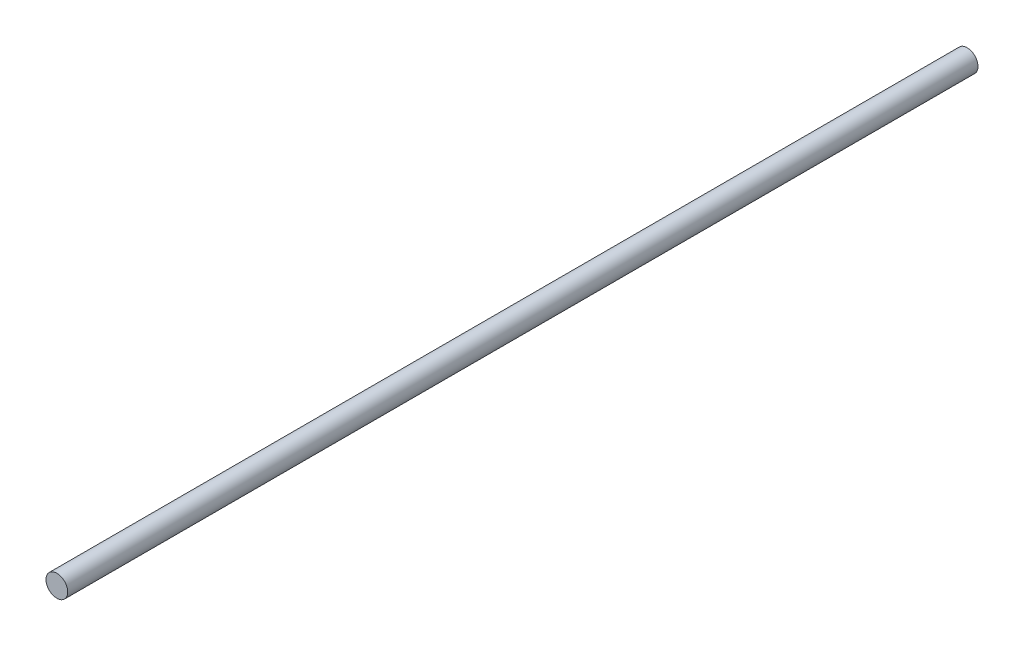
ISO-10303-21;
HEADER;
FILE_DESCRIPTION(('STEP AP214'),'2;1');
FILE_NAME('part.step','',(''),(''),'','','');
FILE_SCHEMA(('AUTOMOTIVE_DESIGN { 1 0 10303 214 1 1 1 1 }'));
ENDSEC;
DATA;
#1=APPLICATION_CONTEXT('core data for automotive mechanical design processes');
#2=APPLICATION_PROTOCOL_DEFINITION('international standard','automotive_design',2000,#1);
#3=PRODUCT_CONTEXT('',#1,'mechanical');
#4=PRODUCT('Part','Part','',(#3));
#5=PRODUCT_RELATED_PRODUCT_CATEGORY('part','',(#4));
#6=PRODUCT_DEFINITION_FORMATION('','',#4);
#7=PRODUCT_DEFINITION_CONTEXT('part definition',#1,'design');
#8=PRODUCT_DEFINITION('design','',#6,#7);
#9=PRODUCT_DEFINITION_SHAPE('','',#8);
#10=(LENGTH_UNIT() NAMED_UNIT(*) SI_UNIT(.MILLI.,.METRE.));
#11=(NAMED_UNIT(*) PLANE_ANGLE_UNIT() SI_UNIT($,.RADIAN.));
#12=(NAMED_UNIT(*) SI_UNIT($,.STERADIAN.) SOLID_ANGLE_UNIT());
#13=UNCERTAINTY_MEASURE_WITH_UNIT(LENGTH_MEASURE(1.E-05),#10,'distance_accuracy_value','');
#14=(GEOMETRIC_REPRESENTATION_CONTEXT(3) GLOBAL_UNCERTAINTY_ASSIGNED_CONTEXT((#13)) GLOBAL_UNIT_ASSIGNED_CONTEXT((#10,
#11,#12)) REPRESENTATION_CONTEXT('',''));
#15=CARTESIAN_POINT('',(0.,0.,0.));
#16=DIRECTION('',(0.,0.,1.));
#17=DIRECTION('',(1.,0.,0.));
#18=AXIS2_PLACEMENT_3D('',#15,#16,#17);
#19=CARTESIAN_POINT('',(0.,0.,335.));
#20=DIRECTION('',(0.,0.,-1.));
#21=DIRECTION('',(-1.,0.,0.));
#22=AXIS2_PLACEMENT_3D('',#19,#20,#21);
#23=CYLINDRICAL_SURFACE('',#22,4.);
#24=CARTESIAN_POINT('',(0.,0.,335.));
#25=DIRECTION('',(0.,0.,1.));
#26=DIRECTION('',(1.,0.,0.));
#27=AXIS2_PLACEMENT_3D('',#24,#25,#26);
#28=CIRCLE('',#27,4.);
#29=CARTESIAN_POINT('',(4.,0.,335.));
#30=VERTEX_POINT('',#29);
#31=EDGE_CURVE('E10',#30,#30,#28,.T.);
#32=ORIENTED_EDGE('',*,*,#31,.F.);
#33=EDGE_LOOP('',(#32));
#34=FACE_BOUND('',#33,.T.);
#35=CARTESIAN_POINT('',(0.,0.,0.));
#36=DIRECTION('',(0.,0.,1.));
#37=DIRECTION('',(1.,0.,0.));
#38=AXIS2_PLACEMENT_3D('',#35,#36,#37);
#39=CIRCLE('',#38,4.);
#40=CARTESIAN_POINT('',(4.,0.,0.));
#41=VERTEX_POINT('',#40);
#42=EDGE_CURVE('E34',#41,#41,#39,.T.);
#43=ORIENTED_EDGE('',*,*,#42,.T.);
#44=EDGE_LOOP('',(#43));
#45=FACE_BOUND('',#44,.T.);
#46=ADVANCED_FACE('F31',(#34,#45),#23,.T.);
#47=CARTESIAN_POINT('',(0.,0.,335.));
#48=DIRECTION('',(0.,0.,1.));
#49=DIRECTION('',(1.,0.,0.));
#50=AXIS2_PLACEMENT_3D('',#47,#48,#49);
#51=PLANE('',#50);
#52=ORIENTED_EDGE('',*,*,#31,.T.);
#53=EDGE_LOOP('',(#52));
#54=FACE_BOUND('',#53,.T.);
#55=ADVANCED_FACE('F46',(#54),#51,.T.);
#56=CARTESIAN_POINT('',(0.,0.,0.));
#57=DIRECTION('',(0.,0.,1.));
#58=DIRECTION('',(1.,0.,0.));
#59=AXIS2_PLACEMENT_3D('',#56,#57,#58);
#60=PLANE('',#59);
#61=ORIENTED_EDGE('',*,*,#42,.F.);
#62=EDGE_LOOP('',(#61));
#63=FACE_BOUND('',#62,.T.);
#64=ADVANCED_FACE('F44',(#63),#60,.F.);
#65=CLOSED_SHELL('',(#46,#55,#64));
#66=MANIFOLD_SOLID_BREP('B2',#65);
#67=ADVANCED_BREP_SHAPE_REPRESENTATION('',(#18,#66),#14);
#68=SHAPE_DEFINITION_REPRESENTATION(#9,#67);
ENDSEC;
END-ISO-10303-21;
